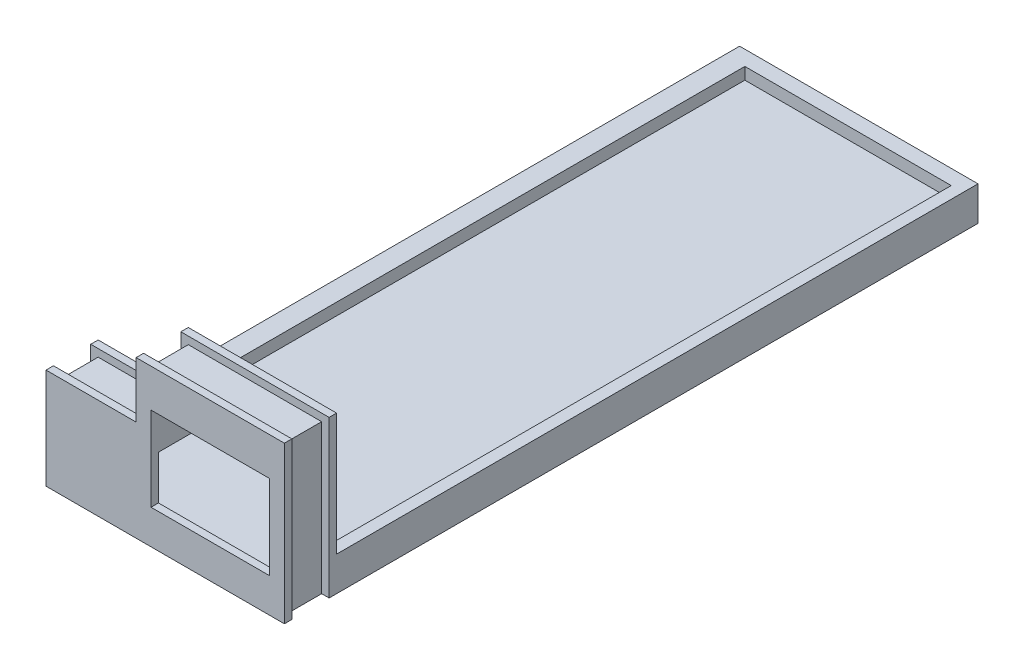
ISO-10303-21;
HEADER;
FILE_DESCRIPTION(('STEP AP214'),'2;1');
FILE_NAME('part.step','',(''),(''),'','','');
FILE_SCHEMA(('AUTOMOTIVE_DESIGN { 1 0 10303 214 1 1 1 1 }'));
ENDSEC;
DATA;
#1=APPLICATION_CONTEXT('core data for automotive mechanical design processes');
#2=APPLICATION_PROTOCOL_DEFINITION('international standard','automotive_design',2000,#1);
#3=PRODUCT_CONTEXT('',#1,'mechanical');
#4=PRODUCT('Part','Part','',(#3));
#5=PRODUCT_RELATED_PRODUCT_CATEGORY('part','',(#4));
#6=PRODUCT_DEFINITION_FORMATION('','',#4);
#7=PRODUCT_DEFINITION_CONTEXT('part definition',#1,'design');
#8=PRODUCT_DEFINITION('design','',#6,#7);
#9=PRODUCT_DEFINITION_SHAPE('','',#8);
#10=(LENGTH_UNIT() NAMED_UNIT(*) SI_UNIT(.MILLI.,.METRE.));
#11=(NAMED_UNIT(*) PLANE_ANGLE_UNIT() SI_UNIT($,.RADIAN.));
#12=(NAMED_UNIT(*) SI_UNIT($,.STERADIAN.) SOLID_ANGLE_UNIT());
#13=UNCERTAINTY_MEASURE_WITH_UNIT(LENGTH_MEASURE(1.E-05),#10,'distance_accuracy_value','');
#14=(GEOMETRIC_REPRESENTATION_CONTEXT(3) GLOBAL_UNCERTAINTY_ASSIGNED_CONTEXT((#13)) GLOBAL_UNIT_ASSIGNED_CONTEXT((#10,
#11,#12)) REPRESENTATION_CONTEXT('',''));
#15=CARTESIAN_POINT('',(0.,0.,0.));
#16=DIRECTION('',(0.,0.,1.));
#17=DIRECTION('',(1.,0.,0.));
#18=AXIS2_PLACEMENT_3D('',#15,#16,#17);
#19=CARTESIAN_POINT('',(11.2913436627,1.6,5.));
#20=DIRECTION('',(0.,1.,0.));
#21=DIRECTION('',(0.,0.,1.));
#22=AXIS2_PLACEMENT_3D('',#19,#20,#21);
#23=PLANE('',#22);
#24=DIRECTION('',(0.,0.,-1.));
#25=VECTOR('',#24,1.);
#26=CARTESIAN_POINT('',(27.1936550673,1.6,5.));
#27=LINE('',#26,#25);
#28=CARTESIAN_POINT('',(27.1936550673,1.6,6.));
#29=VERTEX_POINT('',#28);
#30=CARTESIAN_POINT('',(27.1936550673,1.6,5.));
#31=VERTEX_POINT('',#30);
#32=EDGE_CURVE('E516',#29,#31,#27,.T.);
#33=ORIENTED_EDGE('',*,*,#32,.T.);
#34=DIRECTION('',(1.,0.,0.));
#35=VECTOR('',#34,1.);
#36=CARTESIAN_POINT('',(27.6000558801,1.6,5.));
#37=LINE('',#36,#35);
#38=CARTESIAN_POINT('',(11.2913436627,1.6,5.));
#39=VERTEX_POINT('',#38);
#40=EDGE_CURVE('E343',#39,#31,#37,.T.);
#41=ORIENTED_EDGE('',*,*,#40,.F.);
#42=DIRECTION('',(0.,0.,-1.));
#43=VECTOR('',#42,1.);
#44=CARTESIAN_POINT('',(11.2913436627,1.6,5.));
#45=LINE('',#44,#43);
#46=CARTESIAN_POINT('',(11.2913436627,1.6,6.));
#47=VERTEX_POINT('',#46);
#48=EDGE_CURVE('E520',#47,#39,#45,.T.);
#49=ORIENTED_EDGE('',*,*,#48,.F.);
#50=DIRECTION('',(1.,0.,0.));
#51=VECTOR('',#50,1.);
#52=CARTESIAN_POINT('',(27.1936550673,1.6,6.));
#53=LINE('',#52,#51);
#54=EDGE_CURVE('E367',#47,#29,#53,.T.);
#55=ORIENTED_EDGE('',*,*,#54,.T.);
#56=EDGE_LOOP('',(#33,#41,#49,#55));
#57=FACE_BOUND('',#56,.T.);
#58=ADVANCED_FACE('F38',(#57),#23,.T.);
#59=CARTESIAN_POINT('',(-1.8063449327,9.5,5.));
#60=DIRECTION('',(1.,0.,0.));
#61=DIRECTION('',(0.,1.,0.));
#62=AXIS2_PLACEMENT_3D('',#59,#60,#61);
#63=PLANE('',#62);
#64=DIRECTION('',(0.,-1.,0.));
#65=VECTOR('',#64,1.);
#66=CARTESIAN_POINT('',(-1.8063449327,9.5,0.));
#67=LINE('',#66,#65);
#68=CARTESIAN_POINT('',(-1.8063449327,9.5,0.));
#69=VERTEX_POINT('',#68);
#70=CARTESIAN_POINT('',(-1.8063449327,-3.,0.));
#71=VERTEX_POINT('',#70);
#72=EDGE_CURVE('E524',#69,#71,#67,.T.);
#73=ORIENTED_EDGE('',*,*,#72,.T.);
#74=DIRECTION('',(0.,0.,-1.));
#75=VECTOR('',#74,1.);
#76=CARTESIAN_POINT('',(-1.80634493269999,-3.,5.));
#77=LINE('',#76,#75);
#78=CARTESIAN_POINT('',(-1.80634493269999,-3.,5.));
#79=VERTEX_POINT('',#78);
#80=EDGE_CURVE('E11',#79,#71,#77,.T.);
#81=ORIENTED_EDGE('',*,*,#80,.F.);
#82=DIRECTION('',(0.,-1.,0.));
#83=VECTOR('',#82,1.);
#84=CARTESIAN_POINT('',(-1.8063449327,9.5,5.));
#85=LINE('',#84,#83);
#86=CARTESIAN_POINT('',(-1.8063449327,9.5,5.));
#87=VERTEX_POINT('',#86);
#88=EDGE_CURVE('E525',#87,#79,#85,.T.);
#89=ORIENTED_EDGE('',*,*,#88,.F.);
#90=DIRECTION('',(0.,0.,-1.));
#91=VECTOR('',#90,1.);
#92=CARTESIAN_POINT('',(-1.8063449327,9.5,5.));
#93=LINE('',#92,#91);
#94=EDGE_CURVE('E546',#87,#69,#93,.T.);
#95=ORIENTED_EDGE('',*,*,#94,.T.);
#96=EDGE_LOOP('',(#73,#81,#89,#95));
#97=FACE_BOUND('',#96,.T.);
#98=ADVANCED_FACE('F40',(#97),#63,.F.);
#99=CARTESIAN_POINT('',(-1.80634493269999,-3.,5.));
#100=DIRECTION('',(0.,1.,0.));
#101=DIRECTION('',(0.,0.,1.));
#102=AXIS2_PLACEMENT_3D('',#99,#100,#101);
#103=PLANE('',#102);
#104=ORIENTED_EDGE('',*,*,#80,.T.);
#105=DIRECTION('',(-1.,0.,0.));
#106=VECTOR('',#105,1.);
#107=CARTESIAN_POINT('',(-1.80634493269999,-3.,0.));
#108=LINE('',#107,#106);
#109=CARTESIAN_POINT('',(-2.8063449327,-3.,0.));
#110=VERTEX_POINT('',#109);
#111=EDGE_CURVE('E375',#71,#110,#108,.T.);
#112=ORIENTED_EDGE('',*,*,#111,.T.);
#113=DIRECTION('',(0.,0.,1.));
#114=VECTOR('',#113,1.);
#115=CARTESIAN_POINT('',(-2.8063449327,-3.,-1.));
#116=LINE('',#115,#114);
#117=CARTESIAN_POINT('',(-2.8063449327,-3.,-87.1));
#118=VERTEX_POINT('',#117);
#119=EDGE_CURVE('E443',#118,#110,#116,.T.);
#120=ORIENTED_EDGE('',*,*,#119,.F.);
#121=DIRECTION('',(-1.,0.,0.));
#122=VECTOR('',#121,1.);
#123=CARTESIAN_POINT('',(29.1936550673,-3.,-87.1));
#124=LINE('',#123,#122);
#125=CARTESIAN_POINT('',(29.1936550673,-3.,-87.1));
#126=VERTEX_POINT('',#125);
#127=EDGE_CURVE('E287',#126,#118,#124,.T.);
#128=ORIENTED_EDGE('',*,*,#127,.F.);
#129=DIRECTION('',(0.,0.,1.));
#130=VECTOR('',#129,1.);
#131=CARTESIAN_POINT('',(29.1936550673,-3.,-1.));
#132=LINE('',#131,#130);
#133=CARTESIAN_POINT('',(29.1936550673,-3.,0.));
#134=VERTEX_POINT('',#133);
#135=EDGE_CURVE('E404',#126,#134,#132,.T.);
#136=ORIENTED_EDGE('',*,*,#135,.T.);
#137=CARTESIAN_POINT('',(28.1936550673,-3.00000000000003,0.));
#138=VERTEX_POINT('',#137);
#139=EDGE_CURVE('E405',#134,#138,#108,.T.);
#140=ORIENTED_EDGE('',*,*,#139,.T.);
#141=DIRECTION('',(0.,0.,-1.));
#142=VECTOR('',#141,1.);
#143=CARTESIAN_POINT('',(28.1936550673,-3.,5.));
#144=LINE('',#143,#142);
#145=CARTESIAN_POINT('',(28.1936550673,-3.,5.));
#146=VERTEX_POINT('',#145);
#147=EDGE_CURVE('E47',#146,#138,#144,.T.);
#148=ORIENTED_EDGE('',*,*,#147,.F.);
#149=DIRECTION('',(1.,0.,0.));
#150=VECTOR('',#149,1.);
#151=CARTESIAN_POINT('',(-2.8063449327,-3.,5.));
#152=LINE('',#151,#150);
#153=CARTESIAN_POINT('',(29.1936550673,-3.,5.));
#154=VERTEX_POINT('',#153);
#155=EDGE_CURVE('E484',#146,#154,#152,.T.);
#156=ORIENTED_EDGE('',*,*,#155,.T.);
#157=DIRECTION('',(0.,0.,-1.));
#158=VECTOR('',#157,1.);
#159=CARTESIAN_POINT('',(29.1936550673,-3.,6.));
#160=LINE('',#159,#158);
#161=CARTESIAN_POINT('',(29.1936550673,-3.,6.));
#162=VERTEX_POINT('',#161);
#163=EDGE_CURVE('E468',#162,#154,#160,.T.);
#164=ORIENTED_EDGE('',*,*,#163,.F.);
#165=DIRECTION('',(1.,0.,0.));
#166=VECTOR('',#165,1.);
#167=CARTESIAN_POINT('',(-2.8063449327,-3.,6.));
#168=LINE('',#167,#166);
#169=CARTESIAN_POINT('',(-2.8063449327,-3.,6.));
#170=VERTEX_POINT('',#169);
#171=EDGE_CURVE('E465',#170,#162,#168,.T.);
#172=ORIENTED_EDGE('',*,*,#171,.F.);
#173=DIRECTION('',(0.,0.,-1.));
#174=VECTOR('',#173,1.);
#175=CARTESIAN_POINT('',(-2.8063449327,-3.,6.));
#176=LINE('',#175,#174);
#177=CARTESIAN_POINT('',(-2.8063449327,-3.,5.));
#178=VERTEX_POINT('',#177);
#179=EDGE_CURVE('E491',#170,#178,#176,.T.);
#180=ORIENTED_EDGE('',*,*,#179,.T.);
#181=EDGE_CURVE('E453',#178,#79,#152,.T.);
#182=ORIENTED_EDGE('',*,*,#181,.T.);
#183=EDGE_LOOP('',(#104,#112,#120,#128,#136,#140,#148,#156,#164,#172,#180,#182));
#184=FACE_BOUND('',#183,.T.);
#185=ADVANCED_FACE('F586',(#184),#103,.F.);
#186=CARTESIAN_POINT('',(28.1936550673,-3.,5.));
#187=DIRECTION('',(-1.,0.,0.));
#188=DIRECTION('',(0.,0.,1.));
#189=AXIS2_PLACEMENT_3D('',#186,#187,#188);
#190=PLANE('',#189);
#191=DIRECTION('',(0.,1.,0.));
#192=VECTOR('',#191,1.);
#193=CARTESIAN_POINT('',(28.1936550673,-3.,0.));
#194=LINE('',#193,#192);
#195=CARTESIAN_POINT('',(28.1936550673,17.,0.));
#196=VERTEX_POINT('',#195);
#197=EDGE_CURVE('E550',#138,#196,#194,.T.);
#198=ORIENTED_EDGE('',*,*,#197,.T.);
#199=DIRECTION('',(0.,0.,-1.));
#200=VECTOR('',#199,1.);
#201=CARTESIAN_POINT('',(28.1936550673,17.,5.));
#202=LINE('',#201,#200);
#203=CARTESIAN_POINT('',(28.1936550673,17.,5.));
#204=VERTEX_POINT('',#203);
#205=EDGE_CURVE('E576',#204,#196,#202,.T.);
#206=ORIENTED_EDGE('',*,*,#205,.F.);
#207=DIRECTION('',(0.,1.,0.));
#208=VECTOR('',#207,1.);
#209=CARTESIAN_POINT('',(28.1936550673,-3.,5.));
#210=LINE('',#209,#208);
#211=EDGE_CURVE('E529',#146,#204,#210,.T.);
#212=ORIENTED_EDGE('',*,*,#211,.F.);
#213=ORIENTED_EDGE('',*,*,#147,.T.);
#214=EDGE_LOOP('',(#198,#206,#212,#213));
#215=FACE_BOUND('',#214,.T.);
#216=ADVANCED_FACE('F583',(#215),#190,.F.);
#217=CARTESIAN_POINT('',(28.1936550673,17.,5.));
#218=DIRECTION('',(0.,-1.,0.));
#219=DIRECTION('',(1.,0.,0.));
#220=AXIS2_PLACEMENT_3D('',#217,#218,#219);
#221=PLANE('',#220);
#222=DIRECTION('',(-1.,0.,0.));
#223=VECTOR('',#222,1.);
#224=CARTESIAN_POINT('',(28.1936550673,17.,0.));
#225=LINE('',#224,#223);
#226=CARTESIAN_POINT('',(10.2913436627,17.,0.));
#227=VERTEX_POINT('',#226);
#228=EDGE_CURVE('E554',#196,#227,#225,.T.);
#229=ORIENTED_EDGE('',*,*,#228,.T.);
#230=DIRECTION('',(0.,0.,-1.));
#231=VECTOR('',#230,1.);
#232=CARTESIAN_POINT('',(10.2913436627,17.,5.));
#233=LINE('',#232,#231);
#234=CARTESIAN_POINT('',(10.2913436627,17.,5.));
#235=VERTEX_POINT('',#234);
#236=EDGE_CURVE('E572',#235,#227,#233,.T.);
#237=ORIENTED_EDGE('',*,*,#236,.F.);
#238=DIRECTION('',(-1.,0.,0.));
#239=VECTOR('',#238,1.);
#240=CARTESIAN_POINT('',(28.1936550673,17.,5.));
#241=LINE('',#240,#239);
#242=EDGE_CURVE('E534',#204,#235,#241,.T.);
#243=ORIENTED_EDGE('',*,*,#242,.F.);
#244=ORIENTED_EDGE('',*,*,#205,.T.);
#245=EDGE_LOOP('',(#229,#237,#243,#244));
#246=FACE_BOUND('',#245,.T.);
#247=ADVANCED_FACE('F630',(#246),#221,.F.);
#248=CARTESIAN_POINT('',(10.2913436627,17.,5.));
#249=DIRECTION('',(1.,0.,0.));
#250=DIRECTION('',(0.,1.,0.));
#251=AXIS2_PLACEMENT_3D('',#248,#249,#250);
#252=PLANE('',#251);
#253=DIRECTION('',(0.,-1.,0.));
#254=VECTOR('',#253,1.);
#255=CARTESIAN_POINT('',(10.2913436627,17.,0.));
#256=LINE('',#255,#254);
#257=CARTESIAN_POINT('',(10.2913436627,9.5,0.));
#258=VERTEX_POINT('',#257);
#259=EDGE_CURVE('E558',#227,#258,#256,.T.);
#260=ORIENTED_EDGE('',*,*,#259,.T.);
#261=DIRECTION('',(0.,0.,-1.));
#262=VECTOR('',#261,1.);
#263=CARTESIAN_POINT('',(10.2913436627,9.5,5.));
#264=LINE('',#263,#262);
#265=CARTESIAN_POINT('',(10.2913436627,9.5,5.));
#266=VERTEX_POINT('',#265);
#267=EDGE_CURVE('E568',#266,#258,#264,.T.);
#268=ORIENTED_EDGE('',*,*,#267,.F.);
#269=DIRECTION('',(0.,-1.,0.));
#270=VECTOR('',#269,1.);
#271=CARTESIAN_POINT('',(10.2913436627,17.,5.));
#272=LINE('',#271,#270);
#273=EDGE_CURVE('E538',#235,#266,#272,.T.);
#274=ORIENTED_EDGE('',*,*,#273,.F.);
#275=ORIENTED_EDGE('',*,*,#236,.T.);
#276=EDGE_LOOP('',(#260,#268,#274,#275));
#277=FACE_BOUND('',#276,.T.);
#278=ADVANCED_FACE('F628',(#277),#252,.F.);
#279=CARTESIAN_POINT('',(10.2913436627,9.5,5.));
#280=DIRECTION('',(0.,-1.,0.));
#281=DIRECTION('',(1.,0.,0.));
#282=AXIS2_PLACEMENT_3D('',#279,#280,#281);
#283=PLANE('',#282);
#284=DIRECTION('',(-1.,0.,0.));
#285=VECTOR('',#284,1.);
#286=CARTESIAN_POINT('',(10.2913436627,9.5,0.));
#287=LINE('',#286,#285);
#288=EDGE_CURVE('E530',#258,#69,#287,.T.);
#289=ORIENTED_EDGE('',*,*,#288,.T.);
#290=ORIENTED_EDGE('',*,*,#94,.F.);
#291=DIRECTION('',(-1.,0.,0.));
#292=VECTOR('',#291,1.);
#293=CARTESIAN_POINT('',(10.2913436627,9.5,5.));
#294=LINE('',#293,#292);
#295=EDGE_CURVE('E542',#266,#87,#294,.T.);
#296=ORIENTED_EDGE('',*,*,#295,.F.);
#297=ORIENTED_EDGE('',*,*,#267,.T.);
#298=EDGE_LOOP('',(#289,#290,#296,#297));
#299=FACE_BOUND('',#298,.T.);
#300=ADVANCED_FACE('F622',(#299),#283,.F.);
#301=CARTESIAN_POINT('',(0.,0.,5.));
#302=DIRECTION('',(0.,0.,1.));
#303=DIRECTION('',(1.,0.,0.));
#304=AXIS2_PLACEMENT_3D('',#301,#302,#303);
#305=PLANE('',#304);
#306=ORIENTED_EDGE('',*,*,#295,.T.);
#307=ORIENTED_EDGE('',*,*,#88,.T.);
#308=ORIENTED_EDGE('',*,*,#181,.F.);
#309=DIRECTION('',(0.,-1.,0.));
#310=VECTOR('',#309,1.);
#311=CARTESIAN_POINT('',(-2.8063449327,10.5,5.));
#312=LINE('',#311,#310);
#313=CARTESIAN_POINT('',(-2.8063449327,10.5,5.));
#314=VERTEX_POINT('',#313);
#315=EDGE_CURVE('E481',#314,#178,#312,.T.);
#316=ORIENTED_EDGE('',*,*,#315,.F.);
#317=DIRECTION('',(-1.,0.,0.));
#318=VECTOR('',#317,1.);
#319=CARTESIAN_POINT('',(9.2913436627,10.5,5.));
#320=LINE('',#319,#318);
#321=CARTESIAN_POINT('',(9.2913436627,10.5,5.));
#322=VERTEX_POINT('',#321);
#323=EDGE_CURVE('E478',#322,#314,#320,.T.);
#324=ORIENTED_EDGE('',*,*,#323,.F.);
#325=DIRECTION('',(0.,-1.,0.));
#326=VECTOR('',#325,1.);
#327=CARTESIAN_POINT('',(9.2913436627,18.,5.));
#328=LINE('',#327,#326);
#329=CARTESIAN_POINT('',(9.2913436627,18.,5.));
#330=VERTEX_POINT('',#329);
#331=EDGE_CURVE('E475',#330,#322,#328,.T.);
#332=ORIENTED_EDGE('',*,*,#331,.F.);
#333=DIRECTION('',(-1.,0.,0.));
#334=VECTOR('',#333,1.);
#335=CARTESIAN_POINT('',(29.1936550673,18.,5.));
#336=LINE('',#335,#334);
#337=CARTESIAN_POINT('',(29.1936550673,18.,5.));
#338=VERTEX_POINT('',#337);
#339=EDGE_CURVE('E472',#338,#330,#336,.T.);
#340=ORIENTED_EDGE('',*,*,#339,.F.);
#341=DIRECTION('',(0.,1.,0.));
#342=VECTOR('',#341,1.);
#343=CARTESIAN_POINT('',(29.1936550673,-3.,5.));
#344=LINE('',#343,#342);
#345=EDGE_CURVE('E447',#154,#338,#344,.T.);
#346=ORIENTED_EDGE('',*,*,#345,.F.);
#347=ORIENTED_EDGE('',*,*,#155,.F.);
#348=ORIENTED_EDGE('',*,*,#211,.T.);
#349=ORIENTED_EDGE('',*,*,#242,.T.);
#350=ORIENTED_EDGE('',*,*,#273,.T.);
#351=EDGE_LOOP('',(#306,#307,#308,#316,#324,#332,#340,#346,#347,#348,#349,#350));
#352=FACE_BOUND('',#351,.T.);
#353=ADVANCED_FACE('F624',(#352),#305,.F.);
#354=CARTESIAN_POINT('',(29.1936550673,-3.,6.));
#355=DIRECTION('',(-1.,0.,0.));
#356=DIRECTION('',(0.,0.,1.));
#357=AXIS2_PLACEMENT_3D('',#354,#355,#356);
#358=PLANE('',#357);
#359=ORIENTED_EDGE('',*,*,#345,.T.);
#360=DIRECTION('',(0.,0.,-1.));
#361=VECTOR('',#360,1.);
#362=CARTESIAN_POINT('',(29.1936550673,18.,6.));
#363=LINE('',#362,#361);
#364=CARTESIAN_POINT('',(29.1936550673,18.,6.));
#365=VERTEX_POINT('',#364);
#366=EDGE_CURVE('E507',#365,#338,#363,.T.);
#367=ORIENTED_EDGE('',*,*,#366,.F.);
#368=DIRECTION('',(0.,1.,0.));
#369=VECTOR('',#368,1.);
#370=CARTESIAN_POINT('',(29.1936550673,-3.,6.));
#371=LINE('',#370,#369);
#372=EDGE_CURVE('E448',#162,#365,#371,.T.);
#373=ORIENTED_EDGE('',*,*,#372,.F.);
#374=ORIENTED_EDGE('',*,*,#163,.T.);
#375=EDGE_LOOP('',(#359,#367,#373,#374));
#376=FACE_BOUND('',#375,.T.);
#377=ADVANCED_FACE('F725',(#376),#358,.F.);
#378=CARTESIAN_POINT('',(29.1936550673,18.,6.));
#379=DIRECTION('',(0.,-1.,0.));
#380=DIRECTION('',(1.,0.,0.));
#381=AXIS2_PLACEMENT_3D('',#378,#379,#380);
#382=PLANE('',#381);
#383=ORIENTED_EDGE('',*,*,#339,.T.);
#384=DIRECTION('',(0.,0.,-1.));
#385=VECTOR('',#384,1.);
#386=CARTESIAN_POINT('',(9.2913436627,18.,6.));
#387=LINE('',#386,#385);
#388=CARTESIAN_POINT('',(9.2913436627,18.,6.));
#389=VERTEX_POINT('',#388);
#390=EDGE_CURVE('E503',#389,#330,#387,.T.);
#391=ORIENTED_EDGE('',*,*,#390,.F.);
#392=DIRECTION('',(-1.,0.,0.));
#393=VECTOR('',#392,1.);
#394=CARTESIAN_POINT('',(29.1936550673,18.,6.));
#395=LINE('',#394,#393);
#396=EDGE_CURVE('E452',#365,#389,#395,.T.);
#397=ORIENTED_EDGE('',*,*,#396,.F.);
#398=ORIENTED_EDGE('',*,*,#366,.T.);
#399=EDGE_LOOP('',(#383,#391,#397,#398));
#400=FACE_BOUND('',#399,.T.);
#401=ADVANCED_FACE('F732',(#400),#382,.F.);
#402=CARTESIAN_POINT('',(9.2913436627,18.,6.));
#403=DIRECTION('',(1.,0.,0.));
#404=DIRECTION('',(0.,1.,0.));
#405=AXIS2_PLACEMENT_3D('',#402,#403,#404);
#406=PLANE('',#405);
#407=ORIENTED_EDGE('',*,*,#331,.T.);
#408=DIRECTION('',(0.,0.,-1.));
#409=VECTOR('',#408,1.);
#410=CARTESIAN_POINT('',(9.2913436627,10.5,6.));
#411=LINE('',#410,#409);
#412=CARTESIAN_POINT('',(9.2913436627,10.5,6.));
#413=VERTEX_POINT('',#412);
#414=EDGE_CURVE('E499',#413,#322,#411,.T.);
#415=ORIENTED_EDGE('',*,*,#414,.F.);
#416=DIRECTION('',(0.,-1.,0.));
#417=VECTOR('',#416,1.);
#418=CARTESIAN_POINT('',(9.2913436627,18.,6.));
#419=LINE('',#418,#417);
#420=EDGE_CURVE('E456',#389,#413,#419,.T.);
#421=ORIENTED_EDGE('',*,*,#420,.F.);
#422=ORIENTED_EDGE('',*,*,#390,.T.);
#423=EDGE_LOOP('',(#407,#415,#421,#422));
#424=FACE_BOUND('',#423,.T.);
#425=ADVANCED_FACE('F740',(#424),#406,.F.);
#426=CARTESIAN_POINT('',(9.2913436627,10.5,6.));
#427=DIRECTION('',(0.,-1.,0.));
#428=DIRECTION('',(1.,0.,0.));
#429=AXIS2_PLACEMENT_3D('',#426,#427,#428);
#430=PLANE('',#429);
#431=ORIENTED_EDGE('',*,*,#323,.T.);
#432=DIRECTION('',(0.,0.,-1.));
#433=VECTOR('',#432,1.);
#434=CARTESIAN_POINT('',(-2.8063449327,10.5,6.));
#435=LINE('',#434,#433);
#436=CARTESIAN_POINT('',(-2.8063449327,10.5,6.));
#437=VERTEX_POINT('',#436);
#438=EDGE_CURVE('E495',#437,#314,#435,.T.);
#439=ORIENTED_EDGE('',*,*,#438,.F.);
#440=DIRECTION('',(-1.,0.,0.));
#441=VECTOR('',#440,1.);
#442=CARTESIAN_POINT('',(9.2913436627,10.5,6.));
#443=LINE('',#442,#441);
#444=EDGE_CURVE('E459',#413,#437,#443,.T.);
#445=ORIENTED_EDGE('',*,*,#444,.F.);
#446=ORIENTED_EDGE('',*,*,#414,.T.);
#447=EDGE_LOOP('',(#431,#439,#445,#446));
#448=FACE_BOUND('',#447,.T.);
#449=ADVANCED_FACE('F748',(#448),#430,.F.);
#450=CARTESIAN_POINT('',(-2.8063449327,10.5,6.));
#451=DIRECTION('',(1.,0.,0.));
#452=DIRECTION('',(0.,1.,0.));
#453=AXIS2_PLACEMENT_3D('',#450,#451,#452);
#454=PLANE('',#453);
#455=ORIENTED_EDGE('',*,*,#315,.T.);
#456=ORIENTED_EDGE('',*,*,#179,.F.);
#457=DIRECTION('',(0.,-1.,0.));
#458=VECTOR('',#457,1.);
#459=CARTESIAN_POINT('',(-2.8063449327,10.5,6.));
#460=LINE('',#459,#458);
#461=EDGE_CURVE('E462',#437,#170,#460,.T.);
#462=ORIENTED_EDGE('',*,*,#461,.F.);
#463=ORIENTED_EDGE('',*,*,#438,.T.);
#464=EDGE_LOOP('',(#455,#456,#462,#463));
#465=FACE_BOUND('',#464,.T.);
#466=ADVANCED_FACE('F756',(#465),#454,.F.);
#467=CARTESIAN_POINT('',(0.,0.,6.));
#468=DIRECTION('',(0.,0.,1.));
#469=DIRECTION('',(1.,0.,0.));
#470=AXIS2_PLACEMENT_3D('',#467,#468,#469);
#471=PLANE('',#470);
#472=DIRECTION('',(0.,1.,0.));
#473=VECTOR('',#472,1.);
#474=CARTESIAN_POINT('',(27.1936550673,1.6,6.));
#475=LINE('',#474,#473);
#476=CARTESIAN_POINT('',(27.1936550673,12.9,6.));
#477=VERTEX_POINT('',#476);
#478=EDGE_CURVE('E361',#29,#477,#475,.T.);
#479=ORIENTED_EDGE('',*,*,#478,.F.);
#480=ORIENTED_EDGE('',*,*,#54,.F.);
#481=DIRECTION('',(0.,-1.,0.));
#482=VECTOR('',#481,1.);
#483=CARTESIAN_POINT('',(11.2913436627,1.6,6.));
#484=LINE('',#483,#482);
#485=CARTESIAN_POINT('',(11.2913436627,12.9,6.));
#486=VERTEX_POINT('',#485);
#487=EDGE_CURVE('E381',#486,#47,#484,.T.);
#488=ORIENTED_EDGE('',*,*,#487,.F.);
#489=DIRECTION('',(-1.,0.,0.));
#490=VECTOR('',#489,1.);
#491=CARTESIAN_POINT('',(27.1936550673,12.9,6.));
#492=LINE('',#491,#490);
#493=EDGE_CURVE('E378',#477,#486,#492,.T.);
#494=ORIENTED_EDGE('',*,*,#493,.F.);
#495=EDGE_LOOP('',(#479,#480,#488,#494));
#496=FACE_BOUND('',#495,.T.);
#497=ORIENTED_EDGE('',*,*,#372,.T.);
#498=ORIENTED_EDGE('',*,*,#396,.T.);
#499=ORIENTED_EDGE('',*,*,#420,.T.);
#500=ORIENTED_EDGE('',*,*,#444,.T.);
#501=ORIENTED_EDGE('',*,*,#461,.T.);
#502=ORIENTED_EDGE('',*,*,#171,.T.);
#503=EDGE_LOOP('',(#497,#498,#499,#500,#501,#502));
#504=FACE_BOUND('',#503,.T.);
#505=ADVANCED_FACE('F649',(#496,#504),#471,.T.);
#506=CARTESIAN_POINT('',(-2.8063449327,-3.,-1.));
#507=DIRECTION('',(1.,0.,0.));
#508=DIRECTION('',(0.,1.,0.));
#509=AXIS2_PLACEMENT_3D('',#506,#507,#508);
#510=PLANE('',#509);
#511=DIRECTION('',(0.,1.,0.));
#512=VECTOR('',#511,1.);
#513=CARTESIAN_POINT('',(-2.8063449327,-3.,0.));
#514=LINE('',#513,#512);
#515=CARTESIAN_POINT('',(-2.8063449327,10.5,0.));
#516=VERTEX_POINT('',#515);
#517=EDGE_CURVE('E409',#110,#516,#514,.T.);
#518=ORIENTED_EDGE('',*,*,#517,.T.);
#519=DIRECTION('',(0.,0.,1.));
#520=VECTOR('',#519,1.);
#521=CARTESIAN_POINT('',(-2.8063449327,10.5,-1.));
#522=LINE('',#521,#520);
#523=CARTESIAN_POINT('',(-2.8063449327,10.5,-1.));
#524=VERTEX_POINT('',#523);
#525=EDGE_CURVE('E439',#524,#516,#522,.T.);
#526=ORIENTED_EDGE('',*,*,#525,.F.);
#527=DIRECTION('',(0.,1.,0.));
#528=VECTOR('',#527,1.);
#529=CARTESIAN_POINT('',(-2.8063449327,-3.,-1.));
#530=LINE('',#529,#528);
#531=CARTESIAN_POINT('',(-2.8063449327,1.6,-1.));
#532=VERTEX_POINT('',#531);
#533=EDGE_CURVE('E388',#532,#524,#530,.T.);
#534=ORIENTED_EDGE('',*,*,#533,.F.);
#535=DIRECTION('',(0.,0.,1.));
#536=VECTOR('',#535,1.);
#537=CARTESIAN_POINT('',(-2.8063449327,1.6,-85.1));
#538=LINE('',#537,#536);
#539=CARTESIAN_POINT('',(-2.8063449327,1.6,-87.1));
#540=VERTEX_POINT('',#539);
#541=EDGE_CURVE('E323',#540,#532,#538,.T.);
#542=ORIENTED_EDGE('',*,*,#541,.F.);
#543=DIRECTION('',(0.,1.,0.));
#544=VECTOR('',#543,1.);
#545=CARTESIAN_POINT('',(-2.8063449327,-3.,-87.1));
#546=LINE('',#545,#544);
#547=EDGE_CURVE('E291',#118,#540,#546,.T.);
#548=ORIENTED_EDGE('',*,*,#547,.F.);
#549=ORIENTED_EDGE('',*,*,#119,.T.);
#550=EDGE_LOOP('',(#518,#526,#534,#542,#548,#549));
#551=FACE_BOUND('',#550,.T.);
#552=ADVANCED_FACE('F614',(#551),#510,.F.);
#553=CARTESIAN_POINT('',(-2.8063449327,10.5,-1.));
#554=DIRECTION('',(0.,-1.,0.));
#555=DIRECTION('',(1.,0.,0.));
#556=AXIS2_PLACEMENT_3D('',#553,#554,#555);
#557=PLANE('',#556);
#558=DIRECTION('',(1.,0.,0.));
#559=VECTOR('',#558,1.);
#560=CARTESIAN_POINT('',(-2.8063449327,10.5,0.));
#561=LINE('',#560,#559);
#562=CARTESIAN_POINT('',(9.2913436627,10.5,0.));
#563=VERTEX_POINT('',#562);
#564=EDGE_CURVE('E412',#516,#563,#561,.T.);
#565=ORIENTED_EDGE('',*,*,#564,.T.);
#566=DIRECTION('',(0.,0.,1.));
#567=VECTOR('',#566,1.);
#568=CARTESIAN_POINT('',(9.2913436627,10.5,-1.));
#569=LINE('',#568,#567);
#570=CARTESIAN_POINT('',(9.2913436627,10.5,-1.));
#571=VERTEX_POINT('',#570);
#572=EDGE_CURVE('E435',#571,#563,#569,.T.);
#573=ORIENTED_EDGE('',*,*,#572,.F.);
#574=DIRECTION('',(1.,0.,0.));
#575=VECTOR('',#574,1.);
#576=CARTESIAN_POINT('',(-2.8063449327,10.5,-1.));
#577=LINE('',#576,#575);
#578=EDGE_CURVE('E391',#524,#571,#577,.T.);
#579=ORIENTED_EDGE('',*,*,#578,.F.);
#580=ORIENTED_EDGE('',*,*,#525,.T.);
#581=EDGE_LOOP('',(#565,#573,#579,#580));
#582=FACE_BOUND('',#581,.T.);
#583=ADVANCED_FACE('F611',(#582),#557,.F.);
#584=CARTESIAN_POINT('',(9.2913436627,10.5,-1.));
#585=DIRECTION('',(1.,0.,0.));
#586=DIRECTION('',(0.,1.,0.));
#587=AXIS2_PLACEMENT_3D('',#584,#585,#586);
#588=PLANE('',#587);
#589=DIRECTION('',(0.,1.,0.));
#590=VECTOR('',#589,1.);
#591=CARTESIAN_POINT('',(9.2913436627,10.5,0.));
#592=LINE('',#591,#590);
#593=CARTESIAN_POINT('',(9.2913436627,18.,0.));
#594=VERTEX_POINT('',#593);
#595=EDGE_CURVE('E415',#563,#594,#592,.T.);
#596=ORIENTED_EDGE('',*,*,#595,.T.);
#597=DIRECTION('',(0.,0.,1.));
#598=VECTOR('',#597,1.);
#599=CARTESIAN_POINT('',(9.2913436627,18.,-1.));
#600=LINE('',#599,#598);
#601=CARTESIAN_POINT('',(9.2913436627,18.,-1.));
#602=VERTEX_POINT('',#601);
#603=EDGE_CURVE('E431',#602,#594,#600,.T.);
#604=ORIENTED_EDGE('',*,*,#603,.F.);
#605=DIRECTION('',(0.,1.,0.));
#606=VECTOR('',#605,1.);
#607=CARTESIAN_POINT('',(9.2913436627,10.5,-1.));
#608=LINE('',#607,#606);
#609=EDGE_CURVE('E395',#571,#602,#608,.T.);
#610=ORIENTED_EDGE('',*,*,#609,.F.);
#611=ORIENTED_EDGE('',*,*,#572,.T.);
#612=EDGE_LOOP('',(#596,#604,#610,#611));
#613=FACE_BOUND('',#612,.T.);
#614=ADVANCED_FACE('F606',(#613),#588,.F.);
#615=CARTESIAN_POINT('',(9.2913436627,18.,-1.));
#616=DIRECTION('',(0.,-1.,0.));
#617=DIRECTION('',(1.,0.,0.));
#618=AXIS2_PLACEMENT_3D('',#615,#616,#617);
#619=PLANE('',#618);
#620=DIRECTION('',(1.,0.,0.));
#621=VECTOR('',#620,1.);
#622=CARTESIAN_POINT('',(9.2913436627,18.,0.));
#623=LINE('',#622,#621);
#624=CARTESIAN_POINT('',(29.1936550673,18.,0.));
#625=VERTEX_POINT('',#624);
#626=EDGE_CURVE('E418',#594,#625,#623,.T.);
#627=ORIENTED_EDGE('',*,*,#626,.T.);
#628=DIRECTION('',(0.,0.,1.));
#629=VECTOR('',#628,1.);
#630=CARTESIAN_POINT('',(29.1936550673,18.,-1.));
#631=LINE('',#630,#629);
#632=CARTESIAN_POINT('',(29.1936550673,18.,-1.));
#633=VERTEX_POINT('',#632);
#634=EDGE_CURVE('E427',#633,#625,#631,.T.);
#635=ORIENTED_EDGE('',*,*,#634,.F.);
#636=DIRECTION('',(1.,0.,0.));
#637=VECTOR('',#636,1.);
#638=CARTESIAN_POINT('',(9.2913436627,18.,-1.));
#639=LINE('',#638,#637);
#640=EDGE_CURVE('E398',#602,#633,#639,.T.);
#641=ORIENTED_EDGE('',*,*,#640,.F.);
#642=ORIENTED_EDGE('',*,*,#603,.T.);
#643=EDGE_LOOP('',(#627,#635,#641,#642));
#644=FACE_BOUND('',#643,.T.);
#645=ADVANCED_FACE('F600',(#644),#619,.F.);
#646=CARTESIAN_POINT('',(29.1936550673,18.,-1.));
#647=DIRECTION('',(-1.,0.,0.));
#648=DIRECTION('',(0.,0.,1.));
#649=AXIS2_PLACEMENT_3D('',#646,#647,#648);
#650=PLANE('',#649);
#651=DIRECTION('',(0.,-1.,0.));
#652=VECTOR('',#651,1.);
#653=CARTESIAN_POINT('',(29.1936550673,18.,0.));
#654=LINE('',#653,#652);
#655=EDGE_CURVE('E392',#625,#134,#654,.T.);
#656=ORIENTED_EDGE('',*,*,#655,.T.);
#657=ORIENTED_EDGE('',*,*,#135,.F.);
#658=DIRECTION('',(0.,-1.,0.));
#659=VECTOR('',#658,1.);
#660=CARTESIAN_POINT('',(29.1936550673,-3.,-87.1));
#661=LINE('',#660,#659);
#662=CARTESIAN_POINT('',(29.1936550673,1.6,-87.1));
#663=VERTEX_POINT('',#662);
#664=EDGE_CURVE('E283',#663,#126,#661,.T.);
#665=ORIENTED_EDGE('',*,*,#664,.F.);
#666=DIRECTION('',(0.,0.,1.));
#667=VECTOR('',#666,1.);
#668=CARTESIAN_POINT('',(29.1936550673,1.6,-85.1));
#669=LINE('',#668,#667);
#670=CARTESIAN_POINT('',(29.1936550673,1.6,-1.));
#671=VERTEX_POINT('',#670);
#672=EDGE_CURVE('E327',#663,#671,#669,.T.);
#673=ORIENTED_EDGE('',*,*,#672,.T.);
#674=DIRECTION('',(0.,-1.,0.));
#675=VECTOR('',#674,1.);
#676=CARTESIAN_POINT('',(29.1936550673,18.,-1.));
#677=LINE('',#676,#675);
#678=EDGE_CURVE('E401',#633,#671,#677,.T.);
#679=ORIENTED_EDGE('',*,*,#678,.F.);
#680=ORIENTED_EDGE('',*,*,#634,.T.);
#681=EDGE_LOOP('',(#656,#657,#665,#673,#679,#680));
#682=FACE_BOUND('',#681,.T.);
#683=ADVANCED_FACE('F594',(#682),#650,.F.);
#684=CARTESIAN_POINT('',(0.,0.,-1.));
#685=DIRECTION('',(0.,0.,-1.));
#686=DIRECTION('',(-1.,0.,0.));
#687=AXIS2_PLACEMENT_3D('',#684,#685,#686);
#688=PLANE('',#687);
#689=DIRECTION('',(1.,0.,0.));
#690=VECTOR('',#689,1.);
#691=CARTESIAN_POINT('',(11.2913436627,7.5,-1.));
#692=LINE('',#691,#690);
#693=CARTESIAN_POINT('',(-0.0999999999999994,7.5,-1.));
#694=VERTEX_POINT('',#693);
#695=CARTESIAN_POINT('',(11.2913436627,7.5,-1.));
#696=VERTEX_POINT('',#695);
#697=EDGE_CURVE('E273',#694,#696,#692,.T.);
#698=ORIENTED_EDGE('',*,*,#697,.F.);
#699=DIRECTION('',(0.,1.,0.));
#700=VECTOR('',#699,1.);
#701=CARTESIAN_POINT('',(-0.0999999999999994,1.6,-1.));
#702=LINE('',#701,#700);
#703=CARTESIAN_POINT('',(-0.0999999999999994,1.6,-1.));
#704=VERTEX_POINT('',#703);
#705=EDGE_CURVE('E261',#704,#694,#702,.T.);
#706=ORIENTED_EDGE('',*,*,#705,.F.);
#707=DIRECTION('',(1.,0.,0.));
#708=VECTOR('',#707,1.);
#709=CARTESIAN_POINT('',(-2.8063449327,1.6,-1.));
#710=LINE('',#709,#708);
#711=EDGE_CURVE('E54',#532,#704,#710,.T.);
#712=ORIENTED_EDGE('',*,*,#711,.F.);
#713=ORIENTED_EDGE('',*,*,#533,.T.);
#714=ORIENTED_EDGE('',*,*,#578,.T.);
#715=ORIENTED_EDGE('',*,*,#609,.T.);
#716=ORIENTED_EDGE('',*,*,#640,.T.);
#717=ORIENTED_EDGE('',*,*,#678,.T.);
#718=DIRECTION('',(1.,0.,0.));
#719=VECTOR('',#718,1.);
#720=CARTESIAN_POINT('',(27.6000558801,1.6,-1.));
#721=LINE('',#720,#719);
#722=CARTESIAN_POINT('',(27.6000558801,1.6,-1.));
#723=VERTEX_POINT('',#722);
#724=EDGE_CURVE('E299',#723,#671,#721,.T.);
#725=ORIENTED_EDGE('',*,*,#724,.F.);
#726=DIRECTION('',(1.,0.,0.));
#727=VECTOR('',#726,1.);
#728=CARTESIAN_POINT('',(27.6000558801,1.6,-1.));
#729=LINE('',#728,#727);
#730=CARTESIAN_POINT('',(27.1936550673,1.6,-1.));
#731=VERTEX_POINT('',#730);
#732=EDGE_CURVE('E335',#731,#723,#729,.T.);
#733=ORIENTED_EDGE('',*,*,#732,.F.);
#734=DIRECTION('',(0.,1.,0.));
#735=VECTOR('',#734,1.);
#736=CARTESIAN_POINT('',(27.1936550673,1.6,-1.));
#737=LINE('',#736,#735);
#738=CARTESIAN_POINT('',(27.1936550673,12.9,-1.));
#739=VERTEX_POINT('',#738);
#740=EDGE_CURVE('E362',#731,#739,#737,.T.);
#741=ORIENTED_EDGE('',*,*,#740,.T.);
#742=DIRECTION('',(-1.,0.,0.));
#743=VECTOR('',#742,1.);
#744=CARTESIAN_POINT('',(27.1936550673,12.9,-1.));
#745=LINE('',#744,#743);
#746=CARTESIAN_POINT('',(11.2913436627,12.9,-1.));
#747=VERTEX_POINT('',#746);
#748=EDGE_CURVE('E366',#739,#747,#745,.T.);
#749=ORIENTED_EDGE('',*,*,#748,.T.);
#750=DIRECTION('',(0.,-1.,0.));
#751=VECTOR('',#750,1.);
#752=CARTESIAN_POINT('',(11.2913436627,1.6,-1.));
#753=LINE('',#752,#751);
#754=EDGE_CURVE('E371',#747,#696,#753,.T.);
#755=ORIENTED_EDGE('',*,*,#754,.T.);
#756=EDGE_LOOP('',(#698,#706,#712,#713,#714,#715,#716,#717,#725,#733,#741,#749,#755));
#757=FACE_BOUND('',#756,.T.);
#758=ADVANCED_FACE('F653',(#757),#688,.T.);
#759=CARTESIAN_POINT('',(0.,0.,0.));
#760=DIRECTION('',(0.,0.,-1.));
#761=DIRECTION('',(-1.,0.,0.));
#762=AXIS2_PLACEMENT_3D('',#759,#760,#761);
#763=PLANE('',#762);
#764=ORIENTED_EDGE('',*,*,#72,.F.);
#765=ORIENTED_EDGE('',*,*,#288,.F.);
#766=ORIENTED_EDGE('',*,*,#259,.F.);
#767=ORIENTED_EDGE('',*,*,#228,.F.);
#768=ORIENTED_EDGE('',*,*,#197,.F.);
#769=ORIENTED_EDGE('',*,*,#139,.F.);
#770=ORIENTED_EDGE('',*,*,#655,.F.);
#771=ORIENTED_EDGE('',*,*,#626,.F.);
#772=ORIENTED_EDGE('',*,*,#595,.F.);
#773=ORIENTED_EDGE('',*,*,#564,.F.);
#774=ORIENTED_EDGE('',*,*,#517,.F.);
#775=ORIENTED_EDGE('',*,*,#111,.F.);
#776=EDGE_LOOP('',(#764,#765,#766,#767,#768,#769,#770,#771,#772,#773,#774,#775));
#777=FACE_BOUND('',#776,.T.);
#778=ADVANCED_FACE('F591',(#777),#763,.F.);
#779=CARTESIAN_POINT('',(11.2913436627,12.9,5.));
#780=DIRECTION('',(0.,-1.,0.));
#781=DIRECTION('',(0.,0.,-1.));
#782=AXIS2_PLACEMENT_3D('',#779,#780,#781);
#783=PLANE('',#782);
#784=DIRECTION('',(0.,0.,-1.));
#785=VECTOR('',#784,1.);
#786=CARTESIAN_POINT('',(11.2913436627,12.9,5.));
#787=LINE('',#786,#785);
#788=EDGE_CURVE('E511',#486,#747,#787,.T.);
#789=ORIENTED_EDGE('',*,*,#788,.T.);
#790=ORIENTED_EDGE('',*,*,#748,.F.);
#791=DIRECTION('',(0.,0.,-1.));
#792=VECTOR('',#791,1.);
#793=CARTESIAN_POINT('',(27.1936550673,12.9,5.));
#794=LINE('',#793,#792);
#795=EDGE_CURVE('E62',#477,#739,#794,.T.);
#796=ORIENTED_EDGE('',*,*,#795,.F.);
#797=ORIENTED_EDGE('',*,*,#493,.T.);
#798=EDGE_LOOP('',(#789,#790,#796,#797));
#799=FACE_BOUND('',#798,.T.);
#800=ADVANCED_FACE('F651',(#799),#783,.T.);
#801=CARTESIAN_POINT('',(27.1936550673,12.9,5.));
#802=DIRECTION('',(-1.,0.,0.));
#803=DIRECTION('',(0.,-1.,0.));
#804=AXIS2_PLACEMENT_3D('',#801,#802,#803);
#805=PLANE('',#804);
#806=ORIENTED_EDGE('',*,*,#795,.T.);
#807=ORIENTED_EDGE('',*,*,#740,.F.);
#808=DIRECTION('',(0.,0.,-1.));
#809=VECTOR('',#808,1.);
#810=CARTESIAN_POINT('',(27.1936550673,1.6,5.));
#811=LINE('',#810,#809);
#812=EDGE_CURVE('E351',#31,#731,#811,.T.);
#813=ORIENTED_EDGE('',*,*,#812,.F.);
#814=ORIENTED_EDGE('',*,*,#32,.F.);
#815=ORIENTED_EDGE('',*,*,#478,.T.);
#816=EDGE_LOOP('',(#806,#807,#813,#814,#815));
#817=FACE_BOUND('',#816,.T.);
#818=ADVANCED_FACE('F641',(#817),#805,.T.);
#819=CARTESIAN_POINT('',(11.2913436627,12.9,5.));
#820=DIRECTION('',(1.,0.,0.));
#821=DIRECTION('',(0.,1.,0.));
#822=AXIS2_PLACEMENT_3D('',#819,#820,#821);
#823=PLANE('',#822);
#824=DIRECTION('',(0.,0.,-1.));
#825=VECTOR('',#824,1.);
#826=CARTESIAN_POINT('',(11.2913436627,7.5,5.));
#827=LINE('',#826,#825);
#828=CARTESIAN_POINT('',(11.2913436627,7.5,5.));
#829=VERTEX_POINT('',#828);
#830=EDGE_CURVE('E265',#829,#696,#827,.T.);
#831=ORIENTED_EDGE('',*,*,#830,.T.);
#832=ORIENTED_EDGE('',*,*,#754,.F.);
#833=ORIENTED_EDGE('',*,*,#788,.F.);
#834=ORIENTED_EDGE('',*,*,#487,.T.);
#835=ORIENTED_EDGE('',*,*,#48,.T.);
#836=DIRECTION('',(0.,-1.,0.));
#837=VECTOR('',#836,1.);
#838=CARTESIAN_POINT('',(11.2913436627,1.6,5.));
#839=LINE('',#838,#837);
#840=EDGE_CURVE('E270',#829,#39,#839,.T.);
#841=ORIENTED_EDGE('',*,*,#840,.F.);
#842=EDGE_LOOP('',(#831,#832,#833,#834,#835,#841));
#843=FACE_BOUND('',#842,.T.);
#844=ADVANCED_FACE('F684',(#843),#823,.T.);
#845=CARTESIAN_POINT('',(27.6000558801,1.6,5.));
#846=DIRECTION('',(0.,1.,0.));
#847=DIRECTION('',(0.,0.,1.));
#848=AXIS2_PLACEMENT_3D('',#845,#846,#847);
#849=PLANE('',#848);
#850=ORIENTED_EDGE('',*,*,#812,.T.);
#851=ORIENTED_EDGE('',*,*,#732,.T.);
#852=DIRECTION('',(0.,0.,-1.));
#853=VECTOR('',#852,1.);
#854=CARTESIAN_POINT('',(27.6000558801,1.6,5.));
#855=LINE('',#854,#853);
#856=CARTESIAN_POINT('',(27.6000558801,1.6,5.));
#857=VERTEX_POINT('',#856);
#858=EDGE_CURVE('E347',#857,#723,#855,.T.);
#859=ORIENTED_EDGE('',*,*,#858,.F.);
#860=EDGE_CURVE('E255',#31,#857,#37,.T.);
#861=ORIENTED_EDGE('',*,*,#860,.F.);
#862=EDGE_LOOP('',(#850,#851,#859,#861));
#863=FACE_BOUND('',#862,.T.);
#864=ADVANCED_FACE('F654',(#863),#849,.F.);
#865=CARTESIAN_POINT('',(27.6000558801,1.6,5.));
#866=DIRECTION('',(1.,0.,0.));
#867=DIRECTION('',(0.,0.,-1.));
#868=AXIS2_PLACEMENT_3D('',#865,#866,#867);
#869=PLANE('',#868);
#870=ORIENTED_EDGE('',*,*,#858,.T.);
#871=DIRECTION('',(0.,0.,1.));
#872=VECTOR('',#871,1.);
#873=CARTESIAN_POINT('',(27.6000558801,1.6,-85.1));
#874=LINE('',#873,#872);
#875=CARTESIAN_POINT('',(27.6000558801,1.6,-85.1));
#876=VERTEX_POINT('',#875);
#877=EDGE_CURVE('E331',#876,#723,#874,.T.);
#878=ORIENTED_EDGE('',*,*,#877,.F.);
#879=DIRECTION('',(0.,1.,0.));
#880=VECTOR('',#879,1.);
#881=CARTESIAN_POINT('',(27.6000558801,0.,-85.1));
#882=LINE('',#881,#880);
#883=CARTESIAN_POINT('',(27.6000558801,0.,-85.1));
#884=VERTEX_POINT('',#883);
#885=EDGE_CURVE('E303',#884,#876,#882,.T.);
#886=ORIENTED_EDGE('',*,*,#885,.F.);
#887=DIRECTION('',(0.,0.,-1.));
#888=VECTOR('',#887,1.);
#889=CARTESIAN_POINT('',(27.6000558801,0.,5.));
#890=LINE('',#889,#888);
#891=CARTESIAN_POINT('',(27.6000558801,0.,5.));
#892=VERTEX_POINT('',#891);
#893=EDGE_CURVE('E355',#892,#884,#890,.T.);
#894=ORIENTED_EDGE('',*,*,#893,.F.);
#895=DIRECTION('',(0.,-1.,0.));
#896=VECTOR('',#895,1.);
#897=CARTESIAN_POINT('',(27.6000558801,1.6,5.));
#898=LINE('',#897,#896);
#899=EDGE_CURVE('E336',#857,#892,#898,.T.);
#900=ORIENTED_EDGE('',*,*,#899,.F.);
#901=EDGE_LOOP('',(#870,#878,#886,#894,#900));
#902=FACE_BOUND('',#901,.T.);
#903=ADVANCED_FACE('F657',(#902),#869,.F.);
#904=CARTESIAN_POINT('',(-0.0999999999999994,1.6,5.));
#905=DIRECTION('',(-1.,0.,0.));
#906=DIRECTION('',(0.,0.,1.));
#907=AXIS2_PLACEMENT_3D('',#904,#905,#906);
#908=PLANE('',#907);
#909=DIRECTION('',(0.,0.,-1.));
#910=VECTOR('',#909,1.);
#911=CARTESIAN_POINT('',(-0.0999999999999994,0.,5.));
#912=LINE('',#911,#910);
#913=CARTESIAN_POINT('',(-0.0999999999999994,0.,5.));
#914=VERTEX_POINT('',#913);
#915=CARTESIAN_POINT('',(-0.0999999999999994,0.,-85.1));
#916=VERTEX_POINT('',#915);
#917=EDGE_CURVE('E352',#914,#916,#912,.T.);
#918=ORIENTED_EDGE('',*,*,#917,.T.);
#919=DIRECTION('',(0.,-1.,0.));
#920=VECTOR('',#919,1.);
#921=CARTESIAN_POINT('',(-0.0999999999999994,1.6,-85.1));
#922=LINE('',#921,#920);
#923=CARTESIAN_POINT('',(-0.0999999999999994,1.6,-85.1));
#924=VERTEX_POINT('',#923);
#925=EDGE_CURVE('E307',#924,#916,#922,.T.);
#926=ORIENTED_EDGE('',*,*,#925,.F.);
#927=DIRECTION('',(0.,0.,1.));
#928=VECTOR('',#927,1.);
#929=CARTESIAN_POINT('',(-0.0999999999999994,1.6,-85.1));
#930=LINE('',#929,#928);
#931=EDGE_CURVE('E315',#924,#704,#930,.T.);
#932=ORIENTED_EDGE('',*,*,#931,.T.);
#933=ORIENTED_EDGE('',*,*,#705,.T.);
#934=DIRECTION('',(0.,0.,-1.));
#935=VECTOR('',#934,1.);
#936=CARTESIAN_POINT('',(-0.0999999999999994,7.5,5.));
#937=LINE('',#936,#935);
#938=CARTESIAN_POINT('',(-0.0999999999999994,7.5,5.));
#939=VERTEX_POINT('',#938);
#940=EDGE_CURVE('E258',#939,#694,#937,.T.);
#941=ORIENTED_EDGE('',*,*,#940,.F.);
#942=DIRECTION('',(0.,1.,0.));
#943=VECTOR('',#942,1.);
#944=CARTESIAN_POINT('',(-0.0999999999999994,1.6,5.));
#945=LINE('',#944,#943);
#946=EDGE_CURVE('E244',#914,#939,#945,.T.);
#947=ORIENTED_EDGE('',*,*,#946,.F.);
#948=EDGE_LOOP('',(#918,#926,#932,#933,#941,#947));
#949=FACE_BOUND('',#948,.T.);
#950=ADVANCED_FACE('F259',(#949),#908,.F.);
#951=CARTESIAN_POINT('',(27.6000558801,0.,5.));
#952=DIRECTION('',(0.,-1.,0.));
#953=DIRECTION('',(0.,0.,-1.));
#954=AXIS2_PLACEMENT_3D('',#951,#952,#953);
#955=PLANE('',#954);
#956=ORIENTED_EDGE('',*,*,#893,.T.);
#957=DIRECTION('',(1.,0.,0.));
#958=VECTOR('',#957,1.);
#959=CARTESIAN_POINT('',(-0.0999999999999994,0.,-85.1));
#960=LINE('',#959,#958);
#961=EDGE_CURVE('E311',#916,#884,#960,.T.);
#962=ORIENTED_EDGE('',*,*,#961,.F.);
#963=ORIENTED_EDGE('',*,*,#917,.F.);
#964=DIRECTION('',(-1.,0.,0.));
#965=VECTOR('',#964,1.);
#966=CARTESIAN_POINT('',(27.6000558801,0.,5.));
#967=LINE('',#966,#965);
#968=EDGE_CURVE('E252',#892,#914,#967,.T.);
#969=ORIENTED_EDGE('',*,*,#968,.F.);
#970=EDGE_LOOP('',(#956,#962,#963,#969));
#971=FACE_BOUND('',#970,.T.);
#972=ADVANCED_FACE('F666',(#971),#955,.F.);
#973=CARTESIAN_POINT('',(0.,0.,5.));
#974=DIRECTION('',(0.,0.,-1.));
#975=DIRECTION('',(-1.,0.,0.));
#976=AXIS2_PLACEMENT_3D('',#973,#974,#975);
#977=PLANE('',#976);
#978=ORIENTED_EDGE('',*,*,#899,.T.);
#979=ORIENTED_EDGE('',*,*,#968,.T.);
#980=ORIENTED_EDGE('',*,*,#946,.T.);
#981=DIRECTION('',(1.,0.,0.));
#982=VECTOR('',#981,1.);
#983=CARTESIAN_POINT('',(11.2913436627,7.5,5.));
#984=LINE('',#983,#982);
#985=EDGE_CURVE('E249',#939,#829,#984,.T.);
#986=ORIENTED_EDGE('',*,*,#985,.T.);
#987=ORIENTED_EDGE('',*,*,#840,.T.);
#988=ORIENTED_EDGE('',*,*,#40,.T.);
#989=ORIENTED_EDGE('',*,*,#860,.T.);
#990=EDGE_LOOP('',(#978,#979,#980,#986,#987,#988,#989));
#991=FACE_BOUND('',#990,.T.);
#992=ADVANCED_FACE('F247',(#991),#977,.T.);
#993=CARTESIAN_POINT('',(27.6000558801,1.6,-85.1));
#994=DIRECTION('',(0.,-1.,0.));
#995=DIRECTION('',(1.,0.,0.));
#996=AXIS2_PLACEMENT_3D('',#993,#994,#995);
#997=PLANE('',#996);
#998=ORIENTED_EDGE('',*,*,#724,.T.);
#999=ORIENTED_EDGE('',*,*,#672,.F.);
#1000=DIRECTION('',(1.,0.,0.));
#1001=VECTOR('',#1000,1.);
#1002=CARTESIAN_POINT('',(29.1936550673,1.6,-87.1));
#1003=LINE('',#1002,#1001);
#1004=EDGE_CURVE('E295',#540,#663,#1003,.T.);
#1005=ORIENTED_EDGE('',*,*,#1004,.F.);
#1006=ORIENTED_EDGE('',*,*,#541,.T.);
#1007=ORIENTED_EDGE('',*,*,#711,.T.);
#1008=ORIENTED_EDGE('',*,*,#931,.F.);
#1009=DIRECTION('',(1.,0.,0.));
#1010=VECTOR('',#1009,1.);
#1011=CARTESIAN_POINT('',(29.1936550673,1.6,-85.1));
#1012=LINE('',#1011,#1010);
#1013=EDGE_CURVE('E281',#924,#876,#1012,.T.);
#1014=ORIENTED_EDGE('',*,*,#1013,.T.);
#1015=ORIENTED_EDGE('',*,*,#877,.T.);
#1016=EDGE_LOOP('',(#998,#999,#1005,#1006,#1007,#1008,#1014,#1015));
#1017=FACE_BOUND('',#1016,.T.);
#1018=ADVANCED_FACE('F659',(#1017),#997,.F.);
#1019=CARTESIAN_POINT('',(0.,0.,-87.1));
#1020=DIRECTION('',(0.,0.,1.));
#1021=DIRECTION('',(1.,0.,0.));
#1022=AXIS2_PLACEMENT_3D('',#1019,#1020,#1021);
#1023=PLANE('',#1022);
#1024=ORIENTED_EDGE('',*,*,#664,.T.);
#1025=ORIENTED_EDGE('',*,*,#127,.T.);
#1026=ORIENTED_EDGE('',*,*,#547,.T.);
#1027=ORIENTED_EDGE('',*,*,#1004,.T.);
#1028=EDGE_LOOP('',(#1024,#1025,#1026,#1027));
#1029=FACE_BOUND('',#1028,.T.);
#1030=ADVANCED_FACE('F858',(#1029),#1023,.F.);
#1031=CARTESIAN_POINT('',(0.,0.,-85.1));
#1032=DIRECTION('',(0.,0.,1.));
#1033=DIRECTION('',(1.,0.,0.));
#1034=AXIS2_PLACEMENT_3D('',#1031,#1032,#1033);
#1035=PLANE('',#1034);
#1036=ORIENTED_EDGE('',*,*,#961,.T.);
#1037=ORIENTED_EDGE('',*,*,#885,.T.);
#1038=ORIENTED_EDGE('',*,*,#1013,.F.);
#1039=ORIENTED_EDGE('',*,*,#925,.T.);
#1040=EDGE_LOOP('',(#1036,#1037,#1038,#1039));
#1041=FACE_BOUND('',#1040,.T.);
#1042=ADVANCED_FACE('F663',(#1041),#1035,.T.);
#1043=CARTESIAN_POINT('',(11.2913436627,7.5,5.));
#1044=DIRECTION('',(0.,1.,0.));
#1045=DIRECTION('',(0.,0.,1.));
#1046=AXIS2_PLACEMENT_3D('',#1043,#1044,#1045);
#1047=PLANE('',#1046);
#1048=ORIENTED_EDGE('',*,*,#697,.T.);
#1049=ORIENTED_EDGE('',*,*,#830,.F.);
#1050=ORIENTED_EDGE('',*,*,#985,.F.);
#1051=ORIENTED_EDGE('',*,*,#940,.T.);
#1052=EDGE_LOOP('',(#1048,#1049,#1050,#1051));
#1053=FACE_BOUND('',#1052,.T.);
#1054=ADVANCED_FACE('F267',(#1053),#1047,.F.);
#1055=CLOSED_SHELL('',(#58,#98,#185,#216,#247,#278,#300,#353,#377,#401,#425,#449,#466,#505,#552,
#583,#614,#645,#683,#758,#778,#800,#818,#844,#864,#903,#950,#972,#992,#1018,#1030,#1042,#1054));
#1056=MANIFOLD_SOLID_BREP('B2',#1055);
#1057=ADVANCED_BREP_SHAPE_REPRESENTATION('',(#18,#1056),#14);
#1058=SHAPE_DEFINITION_REPRESENTATION(#9,#1057);
ENDSEC;
END-ISO-10303-21;
